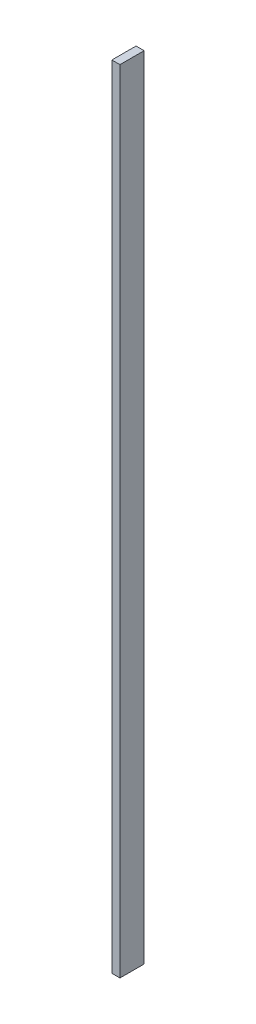
ISO-10303-21;
HEADER;
FILE_DESCRIPTION(('STEP AP214'),'2;1');
FILE_NAME('part.step','',(''),(''),'','','');
FILE_SCHEMA(('AUTOMOTIVE_DESIGN { 1 0 10303 214 1 1 1 1 }'));
ENDSEC;
DATA;
#1=APPLICATION_CONTEXT('core data for automotive mechanical design processes');
#2=APPLICATION_PROTOCOL_DEFINITION('international standard','automotive_design',2000,#1);
#3=PRODUCT_CONTEXT('',#1,'mechanical');
#4=PRODUCT('Part','Part','',(#3));
#5=PRODUCT_RELATED_PRODUCT_CATEGORY('part','',(#4));
#6=PRODUCT_DEFINITION_FORMATION('','',#4);
#7=PRODUCT_DEFINITION_CONTEXT('part definition',#1,'design');
#8=PRODUCT_DEFINITION('design','',#6,#7);
#9=PRODUCT_DEFINITION_SHAPE('','',#8);
#10=(LENGTH_UNIT() NAMED_UNIT(*) SI_UNIT(.MILLI.,.METRE.));
#11=(NAMED_UNIT(*) PLANE_ANGLE_UNIT() SI_UNIT($,.RADIAN.));
#12=(NAMED_UNIT(*) SI_UNIT($,.STERADIAN.) SOLID_ANGLE_UNIT());
#13=UNCERTAINTY_MEASURE_WITH_UNIT(LENGTH_MEASURE(1.E-05),#10,'distance_accuracy_value','');
#14=(GEOMETRIC_REPRESENTATION_CONTEXT(3) GLOBAL_UNCERTAINTY_ASSIGNED_CONTEXT((#13)) GLOBAL_UNIT_ASSIGNED_CONTEXT((#10,
#11,#12)) REPRESENTATION_CONTEXT('',''));
#15=CARTESIAN_POINT('',(0.,0.,0.));
#16=DIRECTION('',(0.,0.,1.));
#17=DIRECTION('',(1.,0.,0.));
#18=AXIS2_PLACEMENT_3D('',#15,#16,#17);
#19=CARTESIAN_POINT('',(6.35,622.3,19.0500000000001));
#20=DIRECTION('',(0.,0.,-1.));
#21=DIRECTION('',(0.,1.,0.));
#22=AXIS2_PLACEMENT_3D('',#19,#20,#21);
#23=PLANE('',#22);
#24=DIRECTION('',(0.,-1.,0.));
#25=VECTOR('',#24,1.);
#26=CARTESIAN_POINT('',(-6.35,622.3,19.0500000000001));
#27=LINE('',#26,#25);
#28=CARTESIAN_POINT('',(-6.35,622.3,19.0500000000001));
#29=VERTEX_POINT('',#28);
#30=CARTESIAN_POINT('',(-6.35,-622.3,19.0499999999999));
#31=VERTEX_POINT('',#30);
#32=EDGE_CURVE('E105',#29,#31,#27,.T.);
#33=ORIENTED_EDGE('',*,*,#32,.T.);
#34=DIRECTION('',(-1.,0.,0.));
#35=VECTOR('',#34,1.);
#36=CARTESIAN_POINT('',(6.35,-622.3,19.0499999999999));
#37=LINE('',#36,#35);
#38=CARTESIAN_POINT('',(6.35,-622.3,19.0499999999999));
#39=VERTEX_POINT('',#38);
#40=EDGE_CURVE('E11',#39,#31,#37,.T.);
#41=ORIENTED_EDGE('',*,*,#40,.F.);
#42=DIRECTION('',(0.,-1.,0.));
#43=VECTOR('',#42,1.);
#44=CARTESIAN_POINT('',(6.35,622.3,19.0500000000001));
#45=LINE('',#44,#43);
#46=CARTESIAN_POINT('',(6.35,622.3,19.0500000000001));
#47=VERTEX_POINT('',#46);
#48=EDGE_CURVE('E89',#47,#39,#45,.T.);
#49=ORIENTED_EDGE('',*,*,#48,.F.);
#50=DIRECTION('',(-1.,0.,0.));
#51=VECTOR('',#50,1.);
#52=CARTESIAN_POINT('',(6.35,622.3,19.0500000000001));
#53=LINE('',#52,#51);
#54=EDGE_CURVE('E98',#47,#29,#53,.T.);
#55=ORIENTED_EDGE('',*,*,#54,.T.);
#56=EDGE_LOOP('',(#33,#41,#49,#55));
#57=FACE_BOUND('',#56,.T.);
#58=ADVANCED_FACE('F39',(#57),#23,.F.);
#59=CARTESIAN_POINT('',(6.35,-622.3,-19.0500000000001));
#60=DIRECTION('',(0.,1.,0.));
#61=DIRECTION('',(0.,0.,1.));
#62=AXIS2_PLACEMENT_3D('',#59,#60,#61);
#63=PLANE('',#62);
#64=DIRECTION('',(0.,0.,-1.));
#65=VECTOR('',#64,1.);
#66=CARTESIAN_POINT('',(-6.35,-622.3,-19.0500000000001));
#67=LINE('',#66,#65);
#68=CARTESIAN_POINT('',(-6.35,-622.3,-19.0500000000001));
#69=VERTEX_POINT('',#68);
#70=EDGE_CURVE('E94',#31,#69,#67,.T.);
#71=ORIENTED_EDGE('',*,*,#70,.T.);
#72=DIRECTION('',(-1.,0.,0.));
#73=VECTOR('',#72,1.);
#74=CARTESIAN_POINT('',(6.35,-622.3,-19.0500000000001));
#75=LINE('',#74,#73);
#76=CARTESIAN_POINT('',(6.35,-622.3,-19.0500000000001));
#77=VERTEX_POINT('',#76);
#78=EDGE_CURVE('E50',#77,#69,#75,.T.);
#79=ORIENTED_EDGE('',*,*,#78,.F.);
#80=DIRECTION('',(0.,0.,-1.));
#81=VECTOR('',#80,1.);
#82=CARTESIAN_POINT('',(6.35,-622.3,-19.0500000000001));
#83=LINE('',#82,#81);
#84=EDGE_CURVE('E83',#39,#77,#83,.T.);
#85=ORIENTED_EDGE('',*,*,#84,.F.);
#86=ORIENTED_EDGE('',*,*,#40,.T.);
#87=EDGE_LOOP('',(#71,#79,#85,#86));
#88=FACE_BOUND('',#87,.T.);
#89=ADVANCED_FACE('F91',(#88),#63,.F.);
#90=CARTESIAN_POINT('',(6.35,622.3,-19.0499999999999));
#91=DIRECTION('',(0.,0.,1.));
#92=DIRECTION('',(0.,-1.,0.));
#93=AXIS2_PLACEMENT_3D('',#90,#91,#92);
#94=PLANE('',#93);
#95=DIRECTION('',(0.,1.,0.));
#96=VECTOR('',#95,1.);
#97=CARTESIAN_POINT('',(-6.35,622.3,-19.0499999999999));
#98=LINE('',#97,#96);
#99=CARTESIAN_POINT('',(-6.35,622.3,-19.0499999999999));
#100=VERTEX_POINT('',#99);
#101=EDGE_CURVE('E75',#69,#100,#98,.T.);
#102=ORIENTED_EDGE('',*,*,#101,.T.);
#103=DIRECTION('',(-1.,0.,0.));
#104=VECTOR('',#103,1.);
#105=CARTESIAN_POINT('',(6.35,622.3,-19.0499999999999));
#106=LINE('',#105,#104);
#107=CARTESIAN_POINT('',(6.35,622.3,-19.0499999999999));
#108=VERTEX_POINT('',#107);
#109=EDGE_CURVE('E92',#108,#100,#106,.T.);
#110=ORIENTED_EDGE('',*,*,#109,.F.);
#111=DIRECTION('',(0.,1.,0.));
#112=VECTOR('',#111,1.);
#113=CARTESIAN_POINT('',(6.35,622.3,-19.0499999999999));
#114=LINE('',#113,#112);
#115=EDGE_CURVE('E86',#77,#108,#114,.T.);
#116=ORIENTED_EDGE('',*,*,#115,.F.);
#117=ORIENTED_EDGE('',*,*,#78,.T.);
#118=EDGE_LOOP('',(#102,#110,#116,#117));
#119=FACE_BOUND('',#118,.T.);
#120=ADVANCED_FACE('F96',(#119),#94,.F.);
#121=CARTESIAN_POINT('',(6.35,622.3,-19.0499999999999));
#122=DIRECTION('',(0.,-1.,0.));
#123=DIRECTION('',(0.,0.,-1.));
#124=AXIS2_PLACEMENT_3D('',#121,#122,#123);
#125=PLANE('',#124);
#126=DIRECTION('',(0.,0.,1.));
#127=VECTOR('',#126,1.);
#128=CARTESIAN_POINT('',(-6.35,622.3,-19.0499999999999));
#129=LINE('',#128,#127);
#130=EDGE_CURVE('E79',#100,#29,#129,.T.);
#131=ORIENTED_EDGE('',*,*,#130,.T.);
#132=ORIENTED_EDGE('',*,*,#54,.F.);
#133=DIRECTION('',(0.,0.,1.));
#134=VECTOR('',#133,1.);
#135=CARTESIAN_POINT('',(6.35,622.3,-19.0499999999999));
#136=LINE('',#135,#134);
#137=EDGE_CURVE('E54',#108,#47,#136,.T.);
#138=ORIENTED_EDGE('',*,*,#137,.F.);
#139=ORIENTED_EDGE('',*,*,#109,.T.);
#140=EDGE_LOOP('',(#131,#132,#138,#139));
#141=FACE_BOUND('',#140,.T.);
#142=ADVANCED_FACE('F108',(#141),#125,.F.);
#143=CARTESIAN_POINT('',(6.35,0.,0.));
#144=DIRECTION('',(-1.,0.,0.));
#145=DIRECTION('',(0.,0.,1.));
#146=AXIS2_PLACEMENT_3D('',#143,#144,#145);
#147=PLANE('',#146);
#148=ORIENTED_EDGE('',*,*,#48,.T.);
#149=ORIENTED_EDGE('',*,*,#84,.T.);
#150=ORIENTED_EDGE('',*,*,#115,.T.);
#151=ORIENTED_EDGE('',*,*,#137,.T.);
#152=EDGE_LOOP('',(#148,#149,#150,#151));
#153=FACE_BOUND('',#152,.T.);
#154=ADVANCED_FACE('F88',(#153),#147,.F.);
#155=CARTESIAN_POINT('',(-6.35,0.,0.));
#156=DIRECTION('',(-1.,0.,0.));
#157=DIRECTION('',(0.,0.,1.));
#158=AXIS2_PLACEMENT_3D('',#155,#156,#157);
#159=PLANE('',#158);
#160=ORIENTED_EDGE('',*,*,#32,.F.);
#161=ORIENTED_EDGE('',*,*,#130,.F.);
#162=ORIENTED_EDGE('',*,*,#101,.F.);
#163=ORIENTED_EDGE('',*,*,#70,.F.);
#164=EDGE_LOOP('',(#160,#161,#162,#163));
#165=FACE_BOUND('',#164,.T.);
#166=ADVANCED_FACE('F115',(#165),#159,.T.);
#167=CLOSED_SHELL('',(#58,#89,#120,#142,#154,#166));
#168=MANIFOLD_SOLID_BREP('B2',#167);
#169=ADVANCED_BREP_SHAPE_REPRESENTATION('',(#18,#168),#14);
#170=SHAPE_DEFINITION_REPRESENTATION(#9,#169);
ENDSEC;
END-ISO-10303-21;
